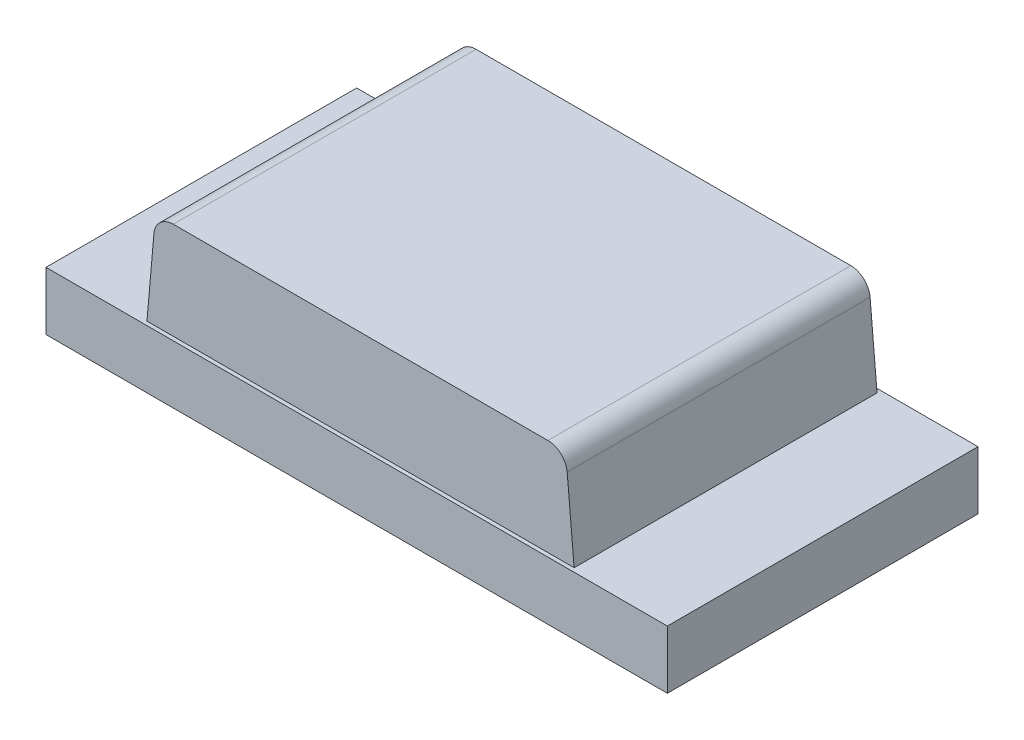
ISO-10303-21;
HEADER;
FILE_DESCRIPTION(('STEP AP214'),'2;1');
FILE_NAME('part.step','',(''),(''),'','','');
FILE_SCHEMA(('AUTOMOTIVE_DESIGN { 1 0 10303 214 1 1 1 1 }'));
ENDSEC;
DATA;
#1=APPLICATION_CONTEXT('core data for automotive mechanical design processes');
#2=APPLICATION_PROTOCOL_DEFINITION('international standard','automotive_design',2000,#1);
#3=PRODUCT_CONTEXT('',#1,'mechanical');
#4=PRODUCT('Part','Part','',(#3));
#5=PRODUCT_RELATED_PRODUCT_CATEGORY('part','',(#4));
#6=PRODUCT_DEFINITION_FORMATION('','',#4);
#7=PRODUCT_DEFINITION_CONTEXT('part definition',#1,'design');
#8=PRODUCT_DEFINITION('design','',#6,#7);
#9=PRODUCT_DEFINITION_SHAPE('','',#8);
#10=(LENGTH_UNIT() NAMED_UNIT(*) SI_UNIT(.MILLI.,.METRE.));
#11=(NAMED_UNIT(*) PLANE_ANGLE_UNIT() SI_UNIT($,.RADIAN.));
#12=(NAMED_UNIT(*) SI_UNIT($,.STERADIAN.) SOLID_ANGLE_UNIT());
#13=UNCERTAINTY_MEASURE_WITH_UNIT(LENGTH_MEASURE(1.E-05),#10,'distance_accuracy_value','');
#14=(GEOMETRIC_REPRESENTATION_CONTEXT(3) GLOBAL_UNCERTAINTY_ASSIGNED_CONTEXT((#13)) GLOBAL_UNIT_ASSIGNED_CONTEXT((#10,
#11,#12)) REPRESENTATION_CONTEXT('',''));
#15=CARTESIAN_POINT('',(0.,0.,0.));
#16=DIRECTION('',(0.,0.,1.));
#17=DIRECTION('',(1.,0.,0.));
#18=AXIS2_PLACEMENT_3D('',#15,#16,#17);
#19=CARTESIAN_POINT('',(0.,0.15,0.));
#20=DIRECTION('',(0.,1.,0.));
#21=DIRECTION('',(0.,0.,1.));
#22=AXIS2_PLACEMENT_3D('',#19,#20,#21);
#23=PLANE('',#22);
#24=DIRECTION('',(0.,0.,1.));
#25=VECTOR('',#24,1.);
#26=CARTESIAN_POINT('',(-0.8,0.15,0.4));
#27=LINE('',#26,#25);
#28=CARTESIAN_POINT('',(-0.8,0.15,-0.4));
#29=VERTEX_POINT('',#28);
#30=CARTESIAN_POINT('',(-0.8,0.15,0.4));
#31=VERTEX_POINT('',#30);
#32=EDGE_CURVE('E146',#29,#31,#27,.T.);
#33=ORIENTED_EDGE('',*,*,#32,.T.);
#34=DIRECTION('',(1.,0.,0.));
#35=VECTOR('',#34,1.);
#36=CARTESIAN_POINT('',(0.8,0.15,0.4));
#37=LINE('',#36,#35);
#38=CARTESIAN_POINT('',(0.8,0.15,0.4));
#39=VERTEX_POINT('',#38);
#40=EDGE_CURVE('E149',#31,#39,#37,.T.);
#41=ORIENTED_EDGE('',*,*,#40,.T.);
#42=DIRECTION('',(0.,0.,-1.));
#43=VECTOR('',#42,1.);
#44=CARTESIAN_POINT('',(0.8,0.15,0.4));
#45=LINE('',#44,#43);
#46=CARTESIAN_POINT('',(0.8,0.15,-0.4));
#47=VERTEX_POINT('',#46);
#48=EDGE_CURVE('E152',#39,#47,#45,.T.);
#49=ORIENTED_EDGE('',*,*,#48,.T.);
#50=DIRECTION('',(-1.,0.,0.));
#51=VECTOR('',#50,1.);
#52=CARTESIAN_POINT('',(0.8,0.15,-0.4));
#53=LINE('',#52,#51);
#54=EDGE_CURVE('E154',#47,#29,#53,.T.);
#55=ORIENTED_EDGE('',*,*,#54,.T.);
#56=EDGE_LOOP('',(#33,#41,#49,#55));
#57=FACE_BOUND('',#56,.T.);
#58=DIRECTION('',(0.,0.,-1.));
#59=VECTOR('',#58,1.);
#60=CARTESIAN_POINT('',(0.55,0.15,1.52805141726785));
#61=LINE('',#60,#59);
#62=CARTESIAN_POINT('',(0.55,0.15,0.39));
#63=VERTEX_POINT('',#62);
#64=CARTESIAN_POINT('',(0.55,0.15,-0.39));
#65=VERTEX_POINT('',#64);
#66=EDGE_CURVE('E136',#63,#65,#61,.T.);
#67=ORIENTED_EDGE('',*,*,#66,.F.);
#68=DIRECTION('',(-1.,0.,0.));
#69=VECTOR('',#68,1.);
#70=CARTESIAN_POINT('',(0.55,0.15,0.39));
#71=LINE('',#70,#69);
#72=CARTESIAN_POINT('',(-0.55,0.15,0.39));
#73=VERTEX_POINT('',#72);
#74=EDGE_CURVE('E135',#63,#73,#71,.T.);
#75=ORIENTED_EDGE('',*,*,#74,.T.);
#76=DIRECTION('',(0.,0.,-1.));
#77=VECTOR('',#76,1.);
#78=CARTESIAN_POINT('',(-0.55,0.15,1.52805141726785));
#79=LINE('',#78,#77);
#80=CARTESIAN_POINT('',(-0.55,0.15,-0.39));
#81=VERTEX_POINT('',#80);
#82=EDGE_CURVE('E129',#73,#81,#79,.T.);
#83=ORIENTED_EDGE('',*,*,#82,.T.);
#84=DIRECTION('',(-1.,0.,0.));
#85=VECTOR('',#84,1.);
#86=CARTESIAN_POINT('',(0.55,0.15,-0.39));
#87=LINE('',#86,#85);
#88=EDGE_CURVE('E115',#65,#81,#87,.T.);
#89=ORIENTED_EDGE('',*,*,#88,.F.);
#90=EDGE_LOOP('',(#67,#75,#83,#89));
#91=FACE_BOUND('',#90,.T.);
#92=ADVANCED_FACE('F36',(#57,#91),#23,.T.);
#93=CARTESIAN_POINT('',(-0.8,0.15,0.4));
#94=DIRECTION('',(1.,0.,0.));
#95=DIRECTION('',(0.,0.,-1.));
#96=AXIS2_PLACEMENT_3D('',#93,#94,#95);
#97=PLANE('',#96);
#98=DIRECTION('',(0.,0.,1.));
#99=VECTOR('',#98,1.);
#100=CARTESIAN_POINT('',(-0.8,0.,0.4));
#101=LINE('',#100,#99);
#102=CARTESIAN_POINT('',(-0.8,0.,-0.4));
#103=VERTEX_POINT('',#102);
#104=CARTESIAN_POINT('',(-0.8,0.,0.4));
#105=VERTEX_POINT('',#104);
#106=EDGE_CURVE('E157',#103,#105,#101,.T.);
#107=ORIENTED_EDGE('',*,*,#106,.T.);
#108=DIRECTION('',(0.,-1.,0.));
#109=VECTOR('',#108,1.);
#110=CARTESIAN_POINT('',(-0.8,0.15,0.4));
#111=LINE('',#110,#109);
#112=EDGE_CURVE('E173',#31,#105,#111,.T.);
#113=ORIENTED_EDGE('',*,*,#112,.F.);
#114=ORIENTED_EDGE('',*,*,#32,.F.);
#115=DIRECTION('',(0.,-1.,0.));
#116=VECTOR('',#115,1.);
#117=CARTESIAN_POINT('',(-0.8,0.15,-0.4));
#118=LINE('',#117,#116);
#119=EDGE_CURVE('E156',#29,#103,#118,.T.);
#120=ORIENTED_EDGE('',*,*,#119,.T.);
#121=EDGE_LOOP('',(#107,#113,#114,#120));
#122=FACE_BOUND('',#121,.T.);
#123=ADVANCED_FACE('F206',(#122),#97,.F.);
#124=CARTESIAN_POINT('',(0.8,0.15,0.4));
#125=DIRECTION('',(0.,0.,-1.));
#126=DIRECTION('',(-1.,0.,0.));
#127=AXIS2_PLACEMENT_3D('',#124,#125,#126);
#128=PLANE('',#127);
#129=DIRECTION('',(1.,0.,0.));
#130=VECTOR('',#129,1.);
#131=CARTESIAN_POINT('',(0.8,0.,0.4));
#132=LINE('',#131,#130);
#133=CARTESIAN_POINT('',(0.8,0.,0.4));
#134=VERTEX_POINT('',#133);
#135=EDGE_CURVE('E160',#105,#134,#132,.T.);
#136=ORIENTED_EDGE('',*,*,#135,.T.);
#137=DIRECTION('',(0.,-1.,0.));
#138=VECTOR('',#137,1.);
#139=CARTESIAN_POINT('',(0.8,0.15,0.4));
#140=LINE('',#139,#138);
#141=EDGE_CURVE('E170',#39,#134,#140,.T.);
#142=ORIENTED_EDGE('',*,*,#141,.F.);
#143=ORIENTED_EDGE('',*,*,#40,.F.);
#144=ORIENTED_EDGE('',*,*,#112,.T.);
#145=EDGE_LOOP('',(#136,#142,#143,#144));
#146=FACE_BOUND('',#145,.T.);
#147=ADVANCED_FACE('F212',(#146),#128,.F.);
#148=CARTESIAN_POINT('',(0.8,0.15,0.4));
#149=DIRECTION('',(-1.,0.,0.));
#150=DIRECTION('',(0.,0.,1.));
#151=AXIS2_PLACEMENT_3D('',#148,#149,#150);
#152=PLANE('',#151);
#153=DIRECTION('',(0.,0.,-1.));
#154=VECTOR('',#153,1.);
#155=CARTESIAN_POINT('',(0.8,0.,0.4));
#156=LINE('',#155,#154);
#157=CARTESIAN_POINT('',(0.8,0.,-0.4));
#158=VERTEX_POINT('',#157);
#159=EDGE_CURVE('E162',#134,#158,#156,.T.);
#160=ORIENTED_EDGE('',*,*,#159,.T.);
#161=DIRECTION('',(0.,-1.,0.));
#162=VECTOR('',#161,1.);
#163=CARTESIAN_POINT('',(0.8,0.15,-0.4));
#164=LINE('',#163,#162);
#165=EDGE_CURVE('E167',#47,#158,#164,.T.);
#166=ORIENTED_EDGE('',*,*,#165,.F.);
#167=ORIENTED_EDGE('',*,*,#48,.F.);
#168=ORIENTED_EDGE('',*,*,#141,.T.);
#169=EDGE_LOOP('',(#160,#166,#167,#168));
#170=FACE_BOUND('',#169,.T.);
#171=ADVANCED_FACE('F225',(#170),#152,.F.);
#172=CARTESIAN_POINT('',(0.8,0.15,-0.4));
#173=DIRECTION('',(0.,0.,1.));
#174=DIRECTION('',(1.,0.,0.));
#175=AXIS2_PLACEMENT_3D('',#172,#173,#174);
#176=PLANE('',#175);
#177=DIRECTION('',(-1.,0.,0.));
#178=VECTOR('',#177,1.);
#179=CARTESIAN_POINT('',(0.8,0.,-0.4));
#180=LINE('',#179,#178);
#181=EDGE_CURVE('E150',#158,#103,#180,.T.);
#182=ORIENTED_EDGE('',*,*,#181,.T.);
#183=ORIENTED_EDGE('',*,*,#119,.F.);
#184=ORIENTED_EDGE('',*,*,#54,.F.);
#185=ORIENTED_EDGE('',*,*,#165,.T.);
#186=EDGE_LOOP('',(#182,#183,#184,#185));
#187=FACE_BOUND('',#186,.T.);
#188=ADVANCED_FACE('F221',(#187),#176,.F.);
#189=CARTESIAN_POINT('',(0.,0.,0.));
#190=DIRECTION('',(0.,1.,0.));
#191=DIRECTION('',(0.,0.,1.));
#192=AXIS2_PLACEMENT_3D('',#189,#190,#191);
#193=PLANE('',#192);
#194=ORIENTED_EDGE('',*,*,#106,.F.);
#195=ORIENTED_EDGE('',*,*,#181,.F.);
#196=ORIENTED_EDGE('',*,*,#159,.F.);
#197=ORIENTED_EDGE('',*,*,#135,.F.);
#198=EDGE_LOOP('',(#194,#195,#196,#197));
#199=FACE_BOUND('',#198,.T.);
#200=ADVANCED_FACE('F218',(#199),#193,.F.);
#201=CARTESIAN_POINT('',(-0.55,0.15,1.52805141726785));
#202=DIRECTION('',(0.996194698091746,-0.0871557427476548,0.));
#203=DIRECTION('',(0.0871557427476548,0.996194698091746,0.));
#204=AXIS2_PLACEMENT_3D('',#201,#202,#203);
#205=PLANE('',#204);
#206=DIRECTION('',(0.0871557427476548,0.996194698091746,0.));
#207=VECTOR('',#206,1.);
#208=CARTESIAN_POINT('',(-0.55,0.15,0.39));
#209=LINE('',#208,#207);
#210=CARTESIAN_POINT('',(-0.532121010322236,0.354357787137383,0.39));
#211=VERTEX_POINT('',#210);
#212=EDGE_CURVE('E138',#73,#211,#209,.T.);
#213=ORIENTED_EDGE('',*,*,#212,.T.);
#214=DIRECTION('',(0.,0.,-1.));
#215=VECTOR('',#214,1.);
#216=CARTESIAN_POINT('',(-0.532121010322236,0.354357787137383,1.52805141726785));
#217=LINE('',#216,#215);
#218=CARTESIAN_POINT('',(-0.532121010322236,0.354357787137383,-0.39));
#219=VERTEX_POINT('',#218);
#220=EDGE_CURVE('E12',#211,#219,#217,.T.);
#221=ORIENTED_EDGE('',*,*,#220,.T.);
#222=DIRECTION('',(0.0871557427476548,0.996194698091746,0.));
#223=VECTOR('',#222,1.);
#224=CARTESIAN_POINT('',(-0.55,0.15,-0.39));
#225=LINE('',#224,#223);
#226=EDGE_CURVE('E119',#81,#219,#225,.T.);
#227=ORIENTED_EDGE('',*,*,#226,.F.);
#228=ORIENTED_EDGE('',*,*,#82,.F.);
#229=EDGE_LOOP('',(#213,#221,#227,#228));
#230=FACE_BOUND('',#229,.T.);
#231=ADVANCED_FACE('F128',(#230),#205,.F.);
#232=CARTESIAN_POINT('',(-0.52812783411852,0.4,1.52805141726785));
#233=DIRECTION('',(0.,-1.,0.));
#234=DIRECTION('',(0.,0.,-1.));
#235=AXIS2_PLACEMENT_3D('',#232,#233,#234);
#236=PLANE('',#235);
#237=DIRECTION('',(1.,0.,0.));
#238=VECTOR('',#237,1.);
#239=CARTESIAN_POINT('',(-0.52812783411852,0.4,0.39));
#240=LINE('',#239,#238);
#241=CARTESIAN_POINT('',(-0.482311275417649,0.4,0.39));
#242=VERTEX_POINT('',#241);
#243=CARTESIAN_POINT('',(0.482311275417648,0.4,0.39));
#244=VERTEX_POINT('',#243);
#245=EDGE_CURVE('E145',#242,#244,#240,.T.);
#246=ORIENTED_EDGE('',*,*,#245,.T.);
#247=DIRECTION('',(0.,0.,-1.));
#248=VECTOR('',#247,1.);
#249=CARTESIAN_POINT('',(0.482311275417649,0.4,1.52805141726785));
#250=LINE('',#249,#248);
#251=CARTESIAN_POINT('',(0.482311275417649,0.4,-0.39));
#252=VERTEX_POINT('',#251);
#253=EDGE_CURVE('E178',#244,#252,#250,.T.);
#254=ORIENTED_EDGE('',*,*,#253,.T.);
#255=DIRECTION('',(1.,0.,0.));
#256=VECTOR('',#255,1.);
#257=CARTESIAN_POINT('',(-0.52812783411852,0.4,-0.39));
#258=LINE('',#257,#256);
#259=CARTESIAN_POINT('',(-0.482311275417649,0.4,-0.39));
#260=VERTEX_POINT('',#259);
#261=EDGE_CURVE('E132',#260,#252,#258,.T.);
#262=ORIENTED_EDGE('',*,*,#261,.F.);
#263=DIRECTION('',(0.,0.,-1.));
#264=VECTOR('',#263,1.);
#265=CARTESIAN_POINT('',(-0.482311275417649,0.4,1.52805141726785));
#266=LINE('',#265,#264);
#267=EDGE_CURVE('E176',#260,#242,#266,.F.);
#268=ORIENTED_EDGE('',*,*,#267,.T.);
#269=EDGE_LOOP('',(#246,#254,#262,#268));
#270=FACE_BOUND('',#269,.T.);
#271=ADVANCED_FACE('F193',(#270),#236,.F.);
#272=CARTESIAN_POINT('',(0.52812783411852,0.4,1.52805141726785));
#273=DIRECTION('',(-0.996194698091746,-0.0871557427476548,0.));
#274=DIRECTION('',(0.0871557427476548,-0.996194698091746,0.));
#275=AXIS2_PLACEMENT_3D('',#272,#273,#274);
#276=PLANE('',#275);
#277=DIRECTION('',(0.0871557427476548,-0.996194698091746,0.));
#278=VECTOR('',#277,1.);
#279=CARTESIAN_POINT('',(0.52812783411852,0.4,-0.39));
#280=LINE('',#279,#278);
#281=CARTESIAN_POINT('',(0.532121010322236,0.354357787137383,-0.39));
#282=VERTEX_POINT('',#281);
#283=EDGE_CURVE('E120',#282,#65,#280,.T.);
#284=ORIENTED_EDGE('',*,*,#283,.F.);
#285=DIRECTION('',(0.,0.,-1.));
#286=VECTOR('',#285,1.);
#287=CARTESIAN_POINT('',(0.532121010322236,0.354357787137383,1.52805141726785));
#288=LINE('',#287,#286);
#289=CARTESIAN_POINT('',(0.532121010322236,0.354357787137383,0.39));
#290=VERTEX_POINT('',#289);
#291=EDGE_CURVE('E59',#282,#290,#288,.F.);
#292=ORIENTED_EDGE('',*,*,#291,.T.);
#293=DIRECTION('',(0.0871557427476548,-0.996194698091746,0.));
#294=VECTOR('',#293,1.);
#295=CARTESIAN_POINT('',(0.52812783411852,0.4,0.39));
#296=LINE('',#295,#294);
#297=EDGE_CURVE('E189',#290,#63,#296,.T.);
#298=ORIENTED_EDGE('',*,*,#297,.T.);
#299=ORIENTED_EDGE('',*,*,#66,.T.);
#300=EDGE_LOOP('',(#284,#292,#298,#299));
#301=FACE_BOUND('',#300,.T.);
#302=ADVANCED_FACE('F198',(#301),#276,.F.);
#303=CARTESIAN_POINT('',(0.8,0.15,0.39));
#304=DIRECTION('',(0.,0.,-1.));
#305=DIRECTION('',(-1.,0.,0.));
#306=AXIS2_PLACEMENT_3D('',#303,#304,#305);
#307=PLANE('',#306);
#308=ORIENTED_EDGE('',*,*,#297,.F.);
#309=CARTESIAN_POINT('',(0.482311275417649,0.35,0.39));
#310=DIRECTION('',(0.,0.,-1.));
#311=DIRECTION('',(-1.,0.,0.));
#312=AXIS2_PLACEMENT_3D('',#309,#310,#311);
#313=CIRCLE('',#312,0.05);
#314=EDGE_CURVE('E44',#290,#244,#313,.F.);
#315=ORIENTED_EDGE('',*,*,#314,.T.);
#316=ORIENTED_EDGE('',*,*,#245,.F.);
#317=CARTESIAN_POINT('',(-0.482311275417649,0.35,0.39));
#318=DIRECTION('',(0.,0.,-1.));
#319=DIRECTION('',(-1.,0.,0.));
#320=AXIS2_PLACEMENT_3D('',#317,#318,#319);
#321=CIRCLE('',#320,0.05);
#322=EDGE_CURVE('E51',#242,#211,#321,.F.);
#323=ORIENTED_EDGE('',*,*,#322,.T.);
#324=ORIENTED_EDGE('',*,*,#212,.F.);
#325=ORIENTED_EDGE('',*,*,#74,.F.);
#326=EDGE_LOOP('',(#308,#315,#316,#323,#324,#325));
#327=FACE_BOUND('',#326,.T.);
#328=ADVANCED_FACE('F188',(#327),#307,.F.);
#329=CARTESIAN_POINT('',(0.8,0.15,-0.39));
#330=DIRECTION('',(0.,0.,1.));
#331=DIRECTION('',(1.,0.,0.));
#332=AXIS2_PLACEMENT_3D('',#329,#330,#331);
#333=PLANE('',#332);
#334=ORIENTED_EDGE('',*,*,#261,.T.);
#335=CARTESIAN_POINT('',(0.482311275417649,0.35,-0.39));
#336=DIRECTION('',(0.,0.,1.));
#337=DIRECTION('',(1.,0.,0.));
#338=AXIS2_PLACEMENT_3D('',#335,#336,#337);
#339=CIRCLE('',#338,0.05);
#340=EDGE_CURVE('E183',#252,#282,#339,.F.);
#341=ORIENTED_EDGE('',*,*,#340,.T.);
#342=ORIENTED_EDGE('',*,*,#283,.T.);
#343=ORIENTED_EDGE('',*,*,#88,.T.);
#344=ORIENTED_EDGE('',*,*,#226,.T.);
#345=CARTESIAN_POINT('',(-0.482311275417649,0.35,-0.39));
#346=DIRECTION('',(0.,0.,1.));
#347=DIRECTION('',(1.,0.,0.));
#348=AXIS2_PLACEMENT_3D('',#345,#346,#347);
#349=CIRCLE('',#348,0.05);
#350=EDGE_CURVE('E181',#219,#260,#349,.F.);
#351=ORIENTED_EDGE('',*,*,#350,.T.);
#352=EDGE_LOOP('',(#334,#341,#342,#343,#344,#351));
#353=FACE_BOUND('',#352,.T.);
#354=ADVANCED_FACE('F118',(#353),#333,.F.);
#355=CARTESIAN_POINT('',(0.482311275417649,0.35,1.52805141726785));
#356=DIRECTION('',(0.,0.,-1.));
#357=DIRECTION('',(-1.,0.,0.));
#358=AXIS2_PLACEMENT_3D('',#355,#356,#357);
#359=CYLINDRICAL_SURFACE('',#358,0.05);
#360=ORIENTED_EDGE('',*,*,#314,.F.);
#361=ORIENTED_EDGE('',*,*,#291,.F.);
#362=ORIENTED_EDGE('',*,*,#340,.F.);
#363=ORIENTED_EDGE('',*,*,#253,.F.);
#364=EDGE_LOOP('',(#360,#361,#362,#363));
#365=FACE_BOUND('',#364,.T.);
#366=ADVANCED_FACE('F197',(#365),#359,.T.);
#367=CARTESIAN_POINT('',(-0.482311275417649,0.35,1.52805141726785));
#368=DIRECTION('',(0.,0.,-1.));
#369=DIRECTION('',(-1.,0.,0.));
#370=AXIS2_PLACEMENT_3D('',#367,#368,#369);
#371=CYLINDRICAL_SURFACE('',#370,0.05);
#372=ORIENTED_EDGE('',*,*,#322,.F.);
#373=ORIENTED_EDGE('',*,*,#267,.F.);
#374=ORIENTED_EDGE('',*,*,#350,.F.);
#375=ORIENTED_EDGE('',*,*,#220,.F.);
#376=EDGE_LOOP('',(#372,#373,#374,#375));
#377=FACE_BOUND('',#376,.T.);
#378=ADVANCED_FACE('F38',(#377),#371,.T.);
#379=CLOSED_SHELL('',(#92,#123,#147,#171,#188,#200,#231,#271,#302,#328,#354,#366,#378));
#380=MANIFOLD_SOLID_BREP('B2',#379);
#381=ADVANCED_BREP_SHAPE_REPRESENTATION('',(#18,#380),#14);
#382=SHAPE_DEFINITION_REPRESENTATION(#9,#381);
ENDSEC;
END-ISO-10303-21;
